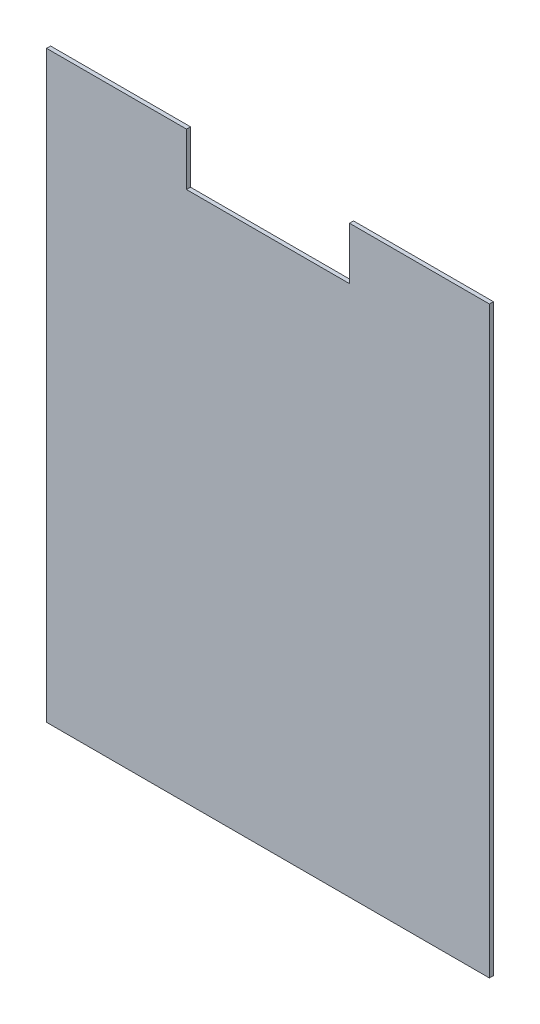
ISO-10303-21;
HEADER;
FILE_DESCRIPTION(('STEP AP214'),'2;1');
FILE_NAME('part.step','',(''),(''),'','','');
FILE_SCHEMA(('AUTOMOTIVE_DESIGN { 1 0 10303 214 1 1 1 1 }'));
ENDSEC;
DATA;
#1=APPLICATION_CONTEXT('core data for automotive mechanical design processes');
#2=APPLICATION_PROTOCOL_DEFINITION('international standard','automotive_design',2000,#1);
#3=PRODUCT_CONTEXT('',#1,'mechanical');
#4=PRODUCT('Part','Part','',(#3));
#5=PRODUCT_RELATED_PRODUCT_CATEGORY('part','',(#4));
#6=PRODUCT_DEFINITION_FORMATION('','',#4);
#7=PRODUCT_DEFINITION_CONTEXT('part definition',#1,'design');
#8=PRODUCT_DEFINITION('design','',#6,#7);
#9=PRODUCT_DEFINITION_SHAPE('','',#8);
#10=(LENGTH_UNIT() NAMED_UNIT(*) SI_UNIT(.MILLI.,.METRE.));
#11=(NAMED_UNIT(*) PLANE_ANGLE_UNIT() SI_UNIT($,.RADIAN.));
#12=(NAMED_UNIT(*) SI_UNIT($,.STERADIAN.) SOLID_ANGLE_UNIT());
#13=UNCERTAINTY_MEASURE_WITH_UNIT(LENGTH_MEASURE(1.E-05),#10,'distance_accuracy_value','');
#14=(GEOMETRIC_REPRESENTATION_CONTEXT(3) GLOBAL_UNCERTAINTY_ASSIGNED_CONTEXT((#13)) GLOBAL_UNIT_ASSIGNED_CONTEXT((#10,
#11,#12)) REPRESENTATION_CONTEXT('',''));
#15=CARTESIAN_POINT('',(0.,0.,0.));
#16=DIRECTION('',(0.,0.,1.));
#17=DIRECTION('',(1.,0.,0.));
#18=AXIS2_PLACEMENT_3D('',#15,#16,#17);
#19=CARTESIAN_POINT('',(110.,0.,0.));
#20=DIRECTION('',(1.,0.,0.));
#21=DIRECTION('',(0.,0.,-1.));
#22=AXIS2_PLACEMENT_3D('',#19,#20,#21);
#23=PLANE('',#22);
#24=DIRECTION('',(0.,1.,0.));
#25=VECTOR('',#24,1.);
#26=CARTESIAN_POINT('',(110.,0.,0.));
#27=LINE('',#26,#25);
#28=CARTESIAN_POINT('',(110.,-145.,0.));
#29=VERTEX_POINT('',#28);
#30=CARTESIAN_POINT('',(110.,145.,0.));
#31=VERTEX_POINT('',#30);
#32=EDGE_CURVE('E121',#29,#31,#27,.T.);
#33=ORIENTED_EDGE('',*,*,#32,.T.);
#34=DIRECTION('',(0.,0.,-1.));
#35=VECTOR('',#34,1.);
#36=CARTESIAN_POINT('',(110.,145.,0.));
#37=LINE('',#36,#35);
#38=CARTESIAN_POINT('',(110.,145.,2.));
#39=VERTEX_POINT('',#38);
#40=EDGE_CURVE('E20',#31,#39,#37,.F.);
#41=ORIENTED_EDGE('',*,*,#40,.T.);
#42=DIRECTION('',(0.,1.,0.));
#43=VECTOR('',#42,1.);
#44=CARTESIAN_POINT('',(110.,0.,2.));
#45=LINE('',#44,#43);
#46=CARTESIAN_POINT('',(110.,-145.,2.));
#47=VERTEX_POINT('',#46);
#48=EDGE_CURVE('E119',#39,#47,#45,.F.);
#49=ORIENTED_EDGE('',*,*,#48,.T.);
#50=DIRECTION('',(0.,0.,1.));
#51=VECTOR('',#50,1.);
#52=CARTESIAN_POINT('',(110.,-145.,0.));
#53=LINE('',#52,#51);
#54=EDGE_CURVE('E128',#47,#29,#53,.F.);
#55=ORIENTED_EDGE('',*,*,#54,.T.);
#56=EDGE_LOOP('',(#33,#41,#49,#55));
#57=FACE_BOUND('',#56,.T.);
#58=ADVANCED_FACE('F17',(#57),#23,.T.);
#59=CARTESIAN_POINT('',(0.,145.,0.));
#60=DIRECTION('',(0.,-1.,0.));
#61=DIRECTION('',(0.,0.,-1.));
#62=AXIS2_PLACEMENT_3D('',#59,#60,#61);
#63=PLANE('',#62);
#64=DIRECTION('',(1.,0.,0.));
#65=VECTOR('',#64,1.);
#66=CARTESIAN_POINT('',(0.,145.,0.));
#67=LINE('',#66,#65);
#68=CARTESIAN_POINT('',(40.5,145.,0.));
#69=VERTEX_POINT('',#68);
#70=EDGE_CURVE('E136',#31,#69,#67,.F.);
#71=ORIENTED_EDGE('',*,*,#70,.T.);
#72=DIRECTION('',(0.,0.,-1.));
#73=VECTOR('',#72,1.);
#74=CARTESIAN_POINT('',(40.5,145.,0.));
#75=LINE('',#74,#73);
#76=CARTESIAN_POINT('',(40.5,145.,2.));
#77=VERTEX_POINT('',#76);
#78=EDGE_CURVE('E112',#69,#77,#75,.F.);
#79=ORIENTED_EDGE('',*,*,#78,.T.);
#80=DIRECTION('',(1.,0.,0.));
#81=VECTOR('',#80,1.);
#82=CARTESIAN_POINT('',(0.,145.,2.));
#83=LINE('',#82,#81);
#84=EDGE_CURVE('E108',#77,#39,#83,.T.);
#85=ORIENTED_EDGE('',*,*,#84,.T.);
#86=ORIENTED_EDGE('',*,*,#40,.F.);
#87=EDGE_LOOP('',(#71,#79,#85,#86));
#88=FACE_BOUND('',#87,.T.);
#89=ADVANCED_FACE('F123',(#88),#63,.F.);
#90=CARTESIAN_POINT('',(40.5,0.,0.));
#91=DIRECTION('',(1.,0.,0.));
#92=DIRECTION('',(0.,0.,-1.));
#93=AXIS2_PLACEMENT_3D('',#90,#91,#92);
#94=PLANE('',#93);
#95=DIRECTION('',(0.,1.,0.));
#96=VECTOR('',#95,1.);
#97=CARTESIAN_POINT('',(40.5,0.,0.));
#98=LINE('',#97,#96);
#99=CARTESIAN_POINT('',(40.5,119.,0.));
#100=VERTEX_POINT('',#99);
#101=EDGE_CURVE('E138',#69,#100,#98,.F.);
#102=ORIENTED_EDGE('',*,*,#101,.T.);
#103=DIRECTION('',(0.,0.,-1.));
#104=VECTOR('',#103,1.);
#105=CARTESIAN_POINT('',(40.5,119.,0.));
#106=LINE('',#105,#104);
#107=CARTESIAN_POINT('',(40.5,119.,2.));
#108=VERTEX_POINT('',#107);
#109=EDGE_CURVE('E79',#100,#108,#106,.F.);
#110=ORIENTED_EDGE('',*,*,#109,.T.);
#111=DIRECTION('',(0.,1.,0.));
#112=VECTOR('',#111,1.);
#113=CARTESIAN_POINT('',(40.5,0.,2.));
#114=LINE('',#113,#112);
#115=EDGE_CURVE('E106',#108,#77,#114,.T.);
#116=ORIENTED_EDGE('',*,*,#115,.T.);
#117=ORIENTED_EDGE('',*,*,#78,.F.);
#118=EDGE_LOOP('',(#102,#110,#116,#117));
#119=FACE_BOUND('',#118,.T.);
#120=ADVANCED_FACE('F163',(#119),#94,.F.);
#121=CARTESIAN_POINT('',(0.,119.,0.));
#122=DIRECTION('',(0.,-1.,0.));
#123=DIRECTION('',(0.,0.,-1.));
#124=AXIS2_PLACEMENT_3D('',#121,#122,#123);
#125=PLANE('',#124);
#126=DIRECTION('',(1.,0.,0.));
#127=VECTOR('',#126,1.);
#128=CARTESIAN_POINT('',(0.,119.,0.));
#129=LINE('',#128,#127);
#130=CARTESIAN_POINT('',(-40.5,119.,0.));
#131=VERTEX_POINT('',#130);
#132=EDGE_CURVE('E91',#100,#131,#129,.F.);
#133=ORIENTED_EDGE('',*,*,#132,.T.);
#134=DIRECTION('',(0.,0.,1.));
#135=VECTOR('',#134,1.);
#136=CARTESIAN_POINT('',(-40.5,119.,0.));
#137=LINE('',#136,#135);
#138=CARTESIAN_POINT('',(-40.5,119.,2.));
#139=VERTEX_POINT('',#138);
#140=EDGE_CURVE('E84',#131,#139,#137,.T.);
#141=ORIENTED_EDGE('',*,*,#140,.T.);
#142=DIRECTION('',(1.,0.,0.));
#143=VECTOR('',#142,1.);
#144=CARTESIAN_POINT('',(0.,119.,2.));
#145=LINE('',#144,#143);
#146=EDGE_CURVE('E88',#139,#108,#145,.T.);
#147=ORIENTED_EDGE('',*,*,#146,.T.);
#148=ORIENTED_EDGE('',*,*,#109,.F.);
#149=EDGE_LOOP('',(#133,#141,#147,#148));
#150=FACE_BOUND('',#149,.T.);
#151=ADVANCED_FACE('F86',(#150),#125,.F.);
#152=CARTESIAN_POINT('',(-40.5,0.,0.));
#153=DIRECTION('',(-1.,0.,0.));
#154=DIRECTION('',(0.,0.,1.));
#155=AXIS2_PLACEMENT_3D('',#152,#153,#154);
#156=PLANE('',#155);
#157=DIRECTION('',(0.,1.,0.));
#158=VECTOR('',#157,1.);
#159=CARTESIAN_POINT('',(-40.5,0.,0.));
#160=LINE('',#159,#158);
#161=CARTESIAN_POINT('',(-40.5,145.,0.));
#162=VERTEX_POINT('',#161);
#163=EDGE_CURVE('E141',#131,#162,#160,.T.);
#164=ORIENTED_EDGE('',*,*,#163,.T.);
#165=DIRECTION('',(0.,0.,-1.));
#166=VECTOR('',#165,1.);
#167=CARTESIAN_POINT('',(-40.5,145.,0.));
#168=LINE('',#167,#166);
#169=CARTESIAN_POINT('',(-40.5,145.,2.));
#170=VERTEX_POINT('',#169);
#171=EDGE_CURVE('E99',#162,#170,#168,.F.);
#172=ORIENTED_EDGE('',*,*,#171,.T.);
#173=DIRECTION('',(0.,1.,0.));
#174=VECTOR('',#173,1.);
#175=CARTESIAN_POINT('',(-40.5,0.,2.));
#176=LINE('',#175,#174);
#177=EDGE_CURVE('E94',#170,#139,#176,.F.);
#178=ORIENTED_EDGE('',*,*,#177,.T.);
#179=ORIENTED_EDGE('',*,*,#140,.F.);
#180=EDGE_LOOP('',(#164,#172,#178,#179));
#181=FACE_BOUND('',#180,.T.);
#182=ADVANCED_FACE('F97',(#181),#156,.F.);
#183=CARTESIAN_POINT('',(0.,0.,2.));
#184=DIRECTION('',(0.,0.,1.));
#185=DIRECTION('',(1.,0.,0.));
#186=AXIS2_PLACEMENT_3D('',#183,#184,#185);
#187=PLANE('',#186);
#188=DIRECTION('',(1.,0.,0.));
#189=VECTOR('',#188,1.);
#190=CARTESIAN_POINT('',(0.,-145.,2.));
#191=LINE('',#190,#189);
#192=CARTESIAN_POINT('',(-110.,-145.,2.));
#193=VERTEX_POINT('',#192);
#194=EDGE_CURVE('E125',#193,#47,#191,.T.);
#195=ORIENTED_EDGE('',*,*,#194,.T.);
#196=ORIENTED_EDGE('',*,*,#48,.F.);
#197=ORIENTED_EDGE('',*,*,#84,.F.);
#198=ORIENTED_EDGE('',*,*,#115,.F.);
#199=ORIENTED_EDGE('',*,*,#146,.F.);
#200=ORIENTED_EDGE('',*,*,#177,.F.);
#201=DIRECTION('',(1.,0.,0.));
#202=VECTOR('',#201,1.);
#203=CARTESIAN_POINT('',(0.,145.,2.));
#204=LINE('',#203,#202);
#205=CARTESIAN_POINT('',(-110.,145.,2.));
#206=VERTEX_POINT('',#205);
#207=EDGE_CURVE('E143',#170,#206,#204,.F.);
#208=ORIENTED_EDGE('',*,*,#207,.T.);
#209=DIRECTION('',(0.,1.,0.));
#210=VECTOR('',#209,1.);
#211=CARTESIAN_POINT('',(-110.,0.,2.));
#212=LINE('',#211,#210);
#213=EDGE_CURVE('E148',#206,#193,#212,.F.);
#214=ORIENTED_EDGE('',*,*,#213,.T.);
#215=EDGE_LOOP('',(#195,#196,#197,#198,#199,#200,#208,#214));
#216=FACE_BOUND('',#215,.T.);
#217=ADVANCED_FACE('F104',(#216),#187,.T.);
#218=CARTESIAN_POINT('',(0.,-145.,0.));
#219=DIRECTION('',(0.,1.,0.));
#220=DIRECTION('',(0.,0.,1.));
#221=AXIS2_PLACEMENT_3D('',#218,#219,#220);
#222=PLANE('',#221);
#223=DIRECTION('',(1.,0.,0.));
#224=VECTOR('',#223,1.);
#225=CARTESIAN_POINT('',(0.,-145.,0.));
#226=LINE('',#225,#224);
#227=CARTESIAN_POINT('',(-110.,-145.,0.));
#228=VERTEX_POINT('',#227);
#229=EDGE_CURVE('E132',#228,#29,#226,.T.);
#230=ORIENTED_EDGE('',*,*,#229,.T.);
#231=ORIENTED_EDGE('',*,*,#54,.F.);
#232=ORIENTED_EDGE('',*,*,#194,.F.);
#233=DIRECTION('',(0.,0.,1.));
#234=VECTOR('',#233,1.);
#235=CARTESIAN_POINT('',(-110.,-145.,0.));
#236=LINE('',#235,#234);
#237=EDGE_CURVE('E150',#193,#228,#236,.F.);
#238=ORIENTED_EDGE('',*,*,#237,.T.);
#239=EDGE_LOOP('',(#230,#231,#232,#238));
#240=FACE_BOUND('',#239,.T.);
#241=ADVANCED_FACE('F154',(#240),#222,.F.);
#242=CARTESIAN_POINT('',(0.,0.,0.));
#243=DIRECTION('',(0.,0.,1.));
#244=DIRECTION('',(1.,0.,0.));
#245=AXIS2_PLACEMENT_3D('',#242,#243,#244);
#246=PLANE('',#245);
#247=ORIENTED_EDGE('',*,*,#163,.F.);
#248=ORIENTED_EDGE('',*,*,#132,.F.);
#249=ORIENTED_EDGE('',*,*,#101,.F.);
#250=ORIENTED_EDGE('',*,*,#70,.F.);
#251=ORIENTED_EDGE('',*,*,#32,.F.);
#252=ORIENTED_EDGE('',*,*,#229,.F.);
#253=DIRECTION('',(0.,1.,0.));
#254=VECTOR('',#253,1.);
#255=CARTESIAN_POINT('',(-110.,0.,0.));
#256=LINE('',#255,#254);
#257=CARTESIAN_POINT('',(-110.,145.,0.));
#258=VERTEX_POINT('',#257);
#259=EDGE_CURVE('E26',#228,#258,#256,.T.);
#260=ORIENTED_EDGE('',*,*,#259,.T.);
#261=DIRECTION('',(1.,0.,0.));
#262=VECTOR('',#261,1.);
#263=CARTESIAN_POINT('',(0.,145.,0.));
#264=LINE('',#263,#262);
#265=EDGE_CURVE('E145',#258,#162,#264,.T.);
#266=ORIENTED_EDGE('',*,*,#265,.T.);
#267=EDGE_LOOP('',(#247,#248,#249,#250,#251,#252,#260,#266));
#268=FACE_BOUND('',#267,.T.);
#269=ADVANCED_FACE('F157',(#268),#246,.F.);
#270=CARTESIAN_POINT('',(0.,145.,0.));
#271=DIRECTION('',(0.,-1.,0.));
#272=DIRECTION('',(0.,0.,-1.));
#273=AXIS2_PLACEMENT_3D('',#270,#271,#272);
#274=PLANE('',#273);
#275=ORIENTED_EDGE('',*,*,#265,.F.);
#276=DIRECTION('',(0.,0.,1.));
#277=VECTOR('',#276,1.);
#278=CARTESIAN_POINT('',(-110.,145.,0.));
#279=LINE('',#278,#277);
#280=EDGE_CURVE('E11',#258,#206,#279,.T.);
#281=ORIENTED_EDGE('',*,*,#280,.T.);
#282=ORIENTED_EDGE('',*,*,#207,.F.);
#283=ORIENTED_EDGE('',*,*,#171,.F.);
#284=EDGE_LOOP('',(#275,#281,#282,#283));
#285=FACE_BOUND('',#284,.T.);
#286=ADVANCED_FACE('F161',(#285),#274,.F.);
#287=CARTESIAN_POINT('',(-110.,0.,0.));
#288=DIRECTION('',(-1.,0.,0.));
#289=DIRECTION('',(0.,0.,1.));
#290=AXIS2_PLACEMENT_3D('',#287,#288,#289);
#291=PLANE('',#290);
#292=ORIENTED_EDGE('',*,*,#259,.F.);
#293=ORIENTED_EDGE('',*,*,#237,.F.);
#294=ORIENTED_EDGE('',*,*,#213,.F.);
#295=ORIENTED_EDGE('',*,*,#280,.F.);
#296=EDGE_LOOP('',(#292,#293,#294,#295));
#297=FACE_BOUND('',#296,.T.);
#298=ADVANCED_FACE('F159',(#297),#291,.T.);
#299=CLOSED_SHELL('',(#58,#89,#120,#151,#182,#217,#241,#269,#286,#298));
#300=MANIFOLD_SOLID_BREP('B1',#299);
#301=ADVANCED_BREP_SHAPE_REPRESENTATION('',(#18,#300),#14);
#302=SHAPE_DEFINITION_REPRESENTATION(#9,#301);
ENDSEC;
END-ISO-10303-21;
